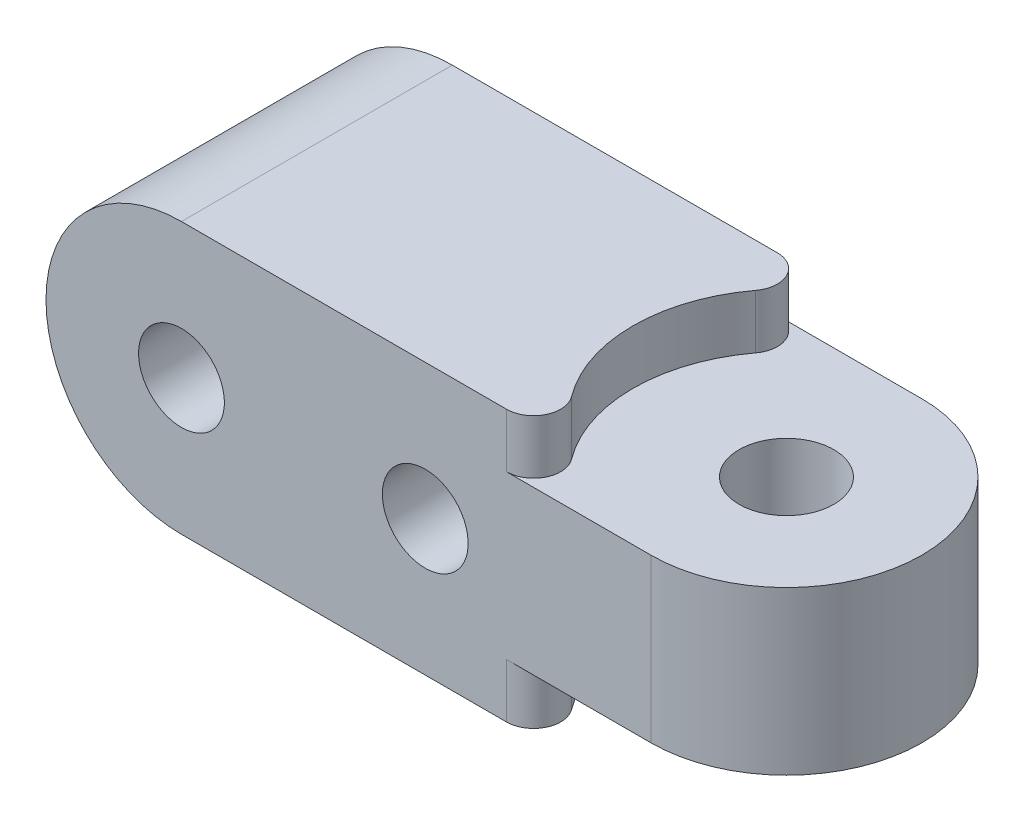
ISO-10303-21;
HEADER;
FILE_DESCRIPTION(('STEP AP214'),'2;1');
FILE_NAME('part.step','',(''),(''),'','','');
FILE_SCHEMA(('AUTOMOTIVE_DESIGN { 1 0 10303 214 1 1 1 1 }'));
ENDSEC;
DATA;
#1=APPLICATION_CONTEXT('core data for automotive mechanical design processes');
#2=APPLICATION_PROTOCOL_DEFINITION('international standard','automotive_design',2000,#1);
#3=PRODUCT_CONTEXT('',#1,'mechanical');
#4=PRODUCT('Part','Part','',(#3));
#5=PRODUCT_RELATED_PRODUCT_CATEGORY('part','',(#4));
#6=PRODUCT_DEFINITION_FORMATION('','',#4);
#7=PRODUCT_DEFINITION_CONTEXT('part definition',#1,'design');
#8=PRODUCT_DEFINITION('design','',#6,#7);
#9=PRODUCT_DEFINITION_SHAPE('','',#8);
#10=(LENGTH_UNIT() NAMED_UNIT(*) SI_UNIT(.MILLI.,.METRE.));
#11=(NAMED_UNIT(*) PLANE_ANGLE_UNIT() SI_UNIT($,.RADIAN.));
#12=(NAMED_UNIT(*) SI_UNIT($,.STERADIAN.) SOLID_ANGLE_UNIT());
#13=UNCERTAINTY_MEASURE_WITH_UNIT(LENGTH_MEASURE(1.E-05),#10,'distance_accuracy_value','');
#14=(GEOMETRIC_REPRESENTATION_CONTEXT(3) GLOBAL_UNCERTAINTY_ASSIGNED_CONTEXT((#13)) GLOBAL_UNIT_ASSIGNED_CONTEXT((#10,
#11,#12)) REPRESENTATION_CONTEXT('',''));
#15=CARTESIAN_POINT('',(0.,0.,0.));
#16=DIRECTION('',(0.,0.,1.));
#17=DIRECTION('',(1.,0.,0.));
#18=AXIS2_PLACEMENT_3D('',#15,#16,#17);
#19=CARTESIAN_POINT('',(0.,1.5,0.));
#20=DIRECTION('',(0.,1.,0.));
#21=DIRECTION('',(0.,0.,1.));
#22=AXIS2_PLACEMENT_3D('',#19,#20,#21);
#23=PLANE('',#22);
#24=DIRECTION('',(1.,0.,0.));
#25=VECTOR('',#24,1.);
#26=CARTESIAN_POINT('',(0.,1.5,-1.5));
#27=LINE('',#26,#25);
#28=CARTESIAN_POINT('',(-1.2,1.5,-1.5));
#29=VERTEX_POINT('',#28);
#30=CARTESIAN_POINT('',(2.4,1.5,-1.5));
#31=VERTEX_POINT('',#30);
#32=EDGE_CURVE('E442',#29,#31,#27,.T.);
#33=ORIENTED_EDGE('',*,*,#32,.F.);
#34=DIRECTION('',(0.,0.,-1.));
#35=VECTOR('',#34,1.);
#36=CARTESIAN_POINT('',(-1.2,1.5,1.5));
#37=LINE('',#36,#35);
#38=CARTESIAN_POINT('',(-1.2,1.5,1.5));
#39=VERTEX_POINT('',#38);
#40=EDGE_CURVE('E452',#39,#29,#37,.T.);
#41=ORIENTED_EDGE('',*,*,#40,.F.);
#42=DIRECTION('',(1.,0.,0.));
#43=VECTOR('',#42,1.);
#44=CARTESIAN_POINT('',(0.,1.5,1.5));
#45=LINE('',#44,#43);
#46=CARTESIAN_POINT('',(2.4,1.5,1.5));
#47=VERTEX_POINT('',#46);
#48=EDGE_CURVE('E219',#39,#47,#45,.T.);
#49=ORIENTED_EDGE('',*,*,#48,.T.);
#50=CARTESIAN_POINT('',(2.4,1.5,1.2));
#51=DIRECTION('',(0.,1.,0.));
#52=DIRECTION('',(0.,0.,1.));
#53=AXIS2_PLACEMENT_3D('',#50,#51,#52);
#54=CIRCLE('',#53,0.300000000000001);
#55=CARTESIAN_POINT('',(2.64,1.5,1.02));
#56=VERTEX_POINT('',#55);
#57=EDGE_CURVE('E129',#56,#47,#54,.F.);
#58=ORIENTED_EDGE('',*,*,#57,.F.);
#59=CARTESIAN_POINT('',(4.,1.5,0.));
#60=DIRECTION('',(0.,1.,0.));
#61=DIRECTION('',(0.,0.,1.));
#62=AXIS2_PLACEMENT_3D('',#59,#60,#61);
#63=CIRCLE('',#62,1.7);
#64=CARTESIAN_POINT('',(2.64,1.5,-1.02));
#65=VERTEX_POINT('',#64);
#66=EDGE_CURVE('E209',#65,#56,#63,.T.);
#67=ORIENTED_EDGE('',*,*,#66,.F.);
#68=CARTESIAN_POINT('',(2.4,1.5,-1.2));
#69=DIRECTION('',(0.,1.,0.));
#70=DIRECTION('',(0.,0.,1.));
#71=AXIS2_PLACEMENT_3D('',#68,#69,#70);
#72=CIRCLE('',#71,0.300000000000001);
#73=EDGE_CURVE('E195',#31,#65,#72,.F.);
#74=ORIENTED_EDGE('',*,*,#73,.F.);
#75=EDGE_LOOP('',(#33,#41,#49,#58,#67,#74));
#76=FACE_BOUND('',#75,.T.);
#77=ADVANCED_FACE('F43',(#76),#23,.T.);
#78=CARTESIAN_POINT('',(0.,-1.5,0.));
#79=DIRECTION('',(0.,1.,0.));
#80=DIRECTION('',(0.,0.,1.));
#81=AXIS2_PLACEMENT_3D('',#78,#79,#80);
#82=PLANE('',#81);
#83=DIRECTION('',(0.,0.,-1.));
#84=VECTOR('',#83,1.);
#85=CARTESIAN_POINT('',(-1.2,-1.5,1.5));
#86=LINE('',#85,#84);
#87=CARTESIAN_POINT('',(-1.2,-1.5,1.5));
#88=VERTEX_POINT('',#87);
#89=CARTESIAN_POINT('',(-1.2,-1.5,-1.5));
#90=VERTEX_POINT('',#89);
#91=EDGE_CURVE('E227',#88,#90,#86,.T.);
#92=ORIENTED_EDGE('',*,*,#91,.T.);
#93=DIRECTION('',(1.,0.,0.));
#94=VECTOR('',#93,1.);
#95=CARTESIAN_POINT('',(0.,-1.5,-1.5));
#96=LINE('',#95,#94);
#97=CARTESIAN_POINT('',(2.4,-1.5,-1.5));
#98=VERTEX_POINT('',#97);
#99=EDGE_CURVE('E197',#90,#98,#96,.T.);
#100=ORIENTED_EDGE('',*,*,#99,.T.);
#101=CARTESIAN_POINT('',(2.4,-1.5,-1.2));
#102=DIRECTION('',(0.,1.,0.));
#103=DIRECTION('',(0.,0.,1.));
#104=AXIS2_PLACEMENT_3D('',#101,#102,#103);
#105=CIRCLE('',#104,0.300000000000001);
#106=CARTESIAN_POINT('',(2.64,-1.5,-1.02));
#107=VERTEX_POINT('',#106);
#108=EDGE_CURVE('E223',#98,#107,#105,.F.);
#109=ORIENTED_EDGE('',*,*,#108,.T.);
#110=CARTESIAN_POINT('',(4.,-1.5,0.));
#111=DIRECTION('',(0.,1.,0.));
#112=DIRECTION('',(0.,0.,1.));
#113=AXIS2_PLACEMENT_3D('',#110,#111,#112);
#114=CIRCLE('',#113,1.7);
#115=CARTESIAN_POINT('',(2.64,-1.5,1.02));
#116=VERTEX_POINT('',#115);
#117=EDGE_CURVE('E193',#107,#116,#114,.T.);
#118=ORIENTED_EDGE('',*,*,#117,.T.);
#119=CARTESIAN_POINT('',(2.4,-1.5,1.2));
#120=DIRECTION('',(0.,1.,0.));
#121=DIRECTION('',(0.,0.,1.));
#122=AXIS2_PLACEMENT_3D('',#119,#120,#121);
#123=CIRCLE('',#122,0.300000000000001);
#124=CARTESIAN_POINT('',(2.4,-1.5,1.5));
#125=VERTEX_POINT('',#124);
#126=EDGE_CURVE('E184',#116,#125,#123,.F.);
#127=ORIENTED_EDGE('',*,*,#126,.T.);
#128=DIRECTION('',(1.,0.,0.));
#129=VECTOR('',#128,1.);
#130=CARTESIAN_POINT('',(0.,-1.5,1.5));
#131=LINE('',#130,#129);
#132=EDGE_CURVE('E177',#88,#125,#131,.T.);
#133=ORIENTED_EDGE('',*,*,#132,.F.);
#134=EDGE_LOOP('',(#92,#100,#109,#118,#127,#133));
#135=FACE_BOUND('',#134,.T.);
#136=ADVANCED_FACE('F189',(#135),#82,.F.);
#137=CARTESIAN_POINT('',(0.,0.9,-1.5));
#138=DIRECTION('',(0.,0.,-1.));
#139=DIRECTION('',(-1.,0.,0.));
#140=AXIS2_PLACEMENT_3D('',#137,#138,#139);
#141=PLANE('',#140);
#142=CARTESIAN_POINT('',(-1.2,0.,-1.5));
#143=DIRECTION('',(0.,0.,1.));
#144=DIRECTION('',(1.,0.,0.));
#145=AXIS2_PLACEMENT_3D('',#142,#143,#144);
#146=CIRCLE('',#145,1.5);
#147=EDGE_CURVE('E58',#29,#90,#146,.T.);
#148=ORIENTED_EDGE('',*,*,#147,.F.);
#149=ORIENTED_EDGE('',*,*,#32,.T.);
#150=DIRECTION('',(0.,-1.,0.));
#151=VECTOR('',#150,1.);
#152=CARTESIAN_POINT('',(2.4,1.5,-1.5));
#153=LINE('',#152,#151);
#154=CARTESIAN_POINT('',(2.4,0.9,-1.5));
#155=VERTEX_POINT('',#154);
#156=EDGE_CURVE('E134',#31,#155,#153,.T.);
#157=ORIENTED_EDGE('',*,*,#156,.T.);
#158=DIRECTION('',(1.,0.,0.));
#159=VECTOR('',#158,1.);
#160=CARTESIAN_POINT('',(0.,0.9,-1.5));
#161=LINE('',#160,#159);
#162=CARTESIAN_POINT('',(4.,0.9,-1.5));
#163=VERTEX_POINT('',#162);
#164=EDGE_CURVE('E95',#155,#163,#161,.T.);
#165=ORIENTED_EDGE('',*,*,#164,.T.);
#166=DIRECTION('',(0.,-1.,0.));
#167=VECTOR('',#166,1.);
#168=CARTESIAN_POINT('',(4.,0.9,-1.5));
#169=LINE('',#168,#167);
#170=CARTESIAN_POINT('',(4.,-0.9,-1.5));
#171=VERTEX_POINT('',#170);
#172=EDGE_CURVE('E51',#163,#171,#169,.T.);
#173=ORIENTED_EDGE('',*,*,#172,.T.);
#174=DIRECTION('',(1.,0.,0.));
#175=VECTOR('',#174,1.);
#176=CARTESIAN_POINT('',(0.,-0.9,-1.5));
#177=LINE('',#176,#175);
#178=CARTESIAN_POINT('',(2.4,-0.9,-1.5));
#179=VERTEX_POINT('',#178);
#180=EDGE_CURVE('E154',#179,#171,#177,.T.);
#181=ORIENTED_EDGE('',*,*,#180,.F.);
#182=EDGE_CURVE('E130',#179,#98,#153,.T.);
#183=ORIENTED_EDGE('',*,*,#182,.T.);
#184=ORIENTED_EDGE('',*,*,#99,.F.);
#185=EDGE_LOOP('',(#148,#149,#157,#165,#173,#181,#183,#184));
#186=FACE_BOUND('',#185,.T.);
#187=CARTESIAN_POINT('',(1.5,0.,-1.5));
#188=DIRECTION('',(0.,0.,-1.));
#189=DIRECTION('',(-1.,0.,0.));
#190=AXIS2_PLACEMENT_3D('',#187,#188,#189);
#191=CIRCLE('',#190,0.474999999999988);
#192=CARTESIAN_POINT('',(1.02500000000001,0.,-1.5));
#193=VERTEX_POINT('',#192);
#194=EDGE_CURVE('E457',#193,#193,#191,.T.);
#195=ORIENTED_EDGE('',*,*,#194,.F.);
#196=EDGE_LOOP('',(#195));
#197=FACE_BOUND('',#196,.T.);
#198=CARTESIAN_POINT('',(-1.2,0.,-1.5));
#199=DIRECTION('',(0.,0.,-1.));
#200=DIRECTION('',(-1.,0.,0.));
#201=AXIS2_PLACEMENT_3D('',#198,#199,#200);
#202=CIRCLE('',#201,0.474999999999988);
#203=CARTESIAN_POINT('',(-1.67499999999999,0.,-1.5));
#204=VERTEX_POINT('',#203);
#205=EDGE_CURVE('E464',#204,#204,#202,.T.);
#206=ORIENTED_EDGE('',*,*,#205,.F.);
#207=EDGE_LOOP('',(#206));
#208=FACE_BOUND('',#207,.T.);
#209=ADVANCED_FACE('F231',(#186,#197,#208),#141,.T.);
#210=CARTESIAN_POINT('',(0.,0.9,1.5));
#211=DIRECTION('',(0.,0.,-1.));
#212=DIRECTION('',(-1.,0.,0.));
#213=AXIS2_PLACEMENT_3D('',#210,#211,#212);
#214=PLANE('',#213);
#215=CARTESIAN_POINT('',(1.5,0.,1.5));
#216=DIRECTION('',(0.,0.,-1.));
#217=DIRECTION('',(-1.,0.,0.));
#218=AXIS2_PLACEMENT_3D('',#215,#216,#217);
#219=CIRCLE('',#218,0.474999999999999);
#220=CARTESIAN_POINT('',(1.025,0.,1.5));
#221=VERTEX_POINT('',#220);
#222=EDGE_CURVE('E461',#221,#221,#219,.T.);
#223=ORIENTED_EDGE('',*,*,#222,.T.);
#224=EDGE_LOOP('',(#223));
#225=FACE_BOUND('',#224,.T.);
#226=CARTESIAN_POINT('',(-1.2,0.,1.5));
#227=DIRECTION('',(0.,0.,-1.));
#228=DIRECTION('',(-1.,0.,0.));
#229=AXIS2_PLACEMENT_3D('',#226,#227,#228);
#230=CIRCLE('',#229,0.474999999999999);
#231=CARTESIAN_POINT('',(-1.675,0.,1.5));
#232=VERTEX_POINT('',#231);
#233=EDGE_CURVE('E224',#232,#232,#230,.T.);
#234=ORIENTED_EDGE('',*,*,#233,.T.);
#235=EDGE_LOOP('',(#234));
#236=FACE_BOUND('',#235,.T.);
#237=ORIENTED_EDGE('',*,*,#48,.F.);
#238=CARTESIAN_POINT('',(-1.2,0.,1.5));
#239=DIRECTION('',(0.,0.,1.));
#240=DIRECTION('',(1.,0.,0.));
#241=AXIS2_PLACEMENT_3D('',#238,#239,#240);
#242=CIRCLE('',#241,1.5);
#243=EDGE_CURVE('E450',#39,#88,#242,.T.);
#244=ORIENTED_EDGE('',*,*,#243,.T.);
#245=ORIENTED_EDGE('',*,*,#132,.T.);
#246=DIRECTION('',(0.,-1.,0.));
#247=VECTOR('',#246,1.);
#248=CARTESIAN_POINT('',(2.4,1.5,1.5));
#249=LINE('',#248,#247);
#250=CARTESIAN_POINT('',(2.4,-0.9,1.5));
#251=VERTEX_POINT('',#250);
#252=EDGE_CURVE('E131',#251,#125,#249,.T.);
#253=ORIENTED_EDGE('',*,*,#252,.F.);
#254=DIRECTION('',(1.,0.,0.));
#255=VECTOR('',#254,1.);
#256=CARTESIAN_POINT('',(0.,-0.9,1.5));
#257=LINE('',#256,#255);
#258=CARTESIAN_POINT('',(4.,-0.9,1.5));
#259=VERTEX_POINT('',#258);
#260=EDGE_CURVE('E165',#251,#259,#257,.T.);
#261=ORIENTED_EDGE('',*,*,#260,.T.);
#262=DIRECTION('',(0.,-1.,0.));
#263=VECTOR('',#262,1.);
#264=CARTESIAN_POINT('',(4.,0.9,1.5));
#265=LINE('',#264,#263);
#266=CARTESIAN_POINT('',(4.,0.9,1.5));
#267=VERTEX_POINT('',#266);
#268=EDGE_CURVE('E11',#267,#259,#265,.T.);
#269=ORIENTED_EDGE('',*,*,#268,.F.);
#270=DIRECTION('',(1.,0.,0.));
#271=VECTOR('',#270,1.);
#272=CARTESIAN_POINT('',(0.,0.9,1.5));
#273=LINE('',#272,#271);
#274=CARTESIAN_POINT('',(2.4,0.9,1.5));
#275=VERTEX_POINT('',#274);
#276=EDGE_CURVE('E107',#275,#267,#273,.T.);
#277=ORIENTED_EDGE('',*,*,#276,.F.);
#278=EDGE_CURVE('E113',#47,#275,#249,.T.);
#279=ORIENTED_EDGE('',*,*,#278,.F.);
#280=EDGE_LOOP('',(#237,#244,#245,#253,#261,#269,#277,#279));
#281=FACE_BOUND('',#280,.T.);
#282=ADVANCED_FACE('F110',(#225,#236,#281),#214,.F.);
#283=CARTESIAN_POINT('',(4.,0.9,0.));
#284=DIRECTION('',(0.,-1.,0.));
#285=DIRECTION('',(0.,0.,-1.));
#286=AXIS2_PLACEMENT_3D('',#283,#284,#285);
#287=CYLINDRICAL_SURFACE('',#286,0.524999999999999);
#288=CARTESIAN_POINT('',(4.,0.9,0.));
#289=DIRECTION('',(0.,1.,0.));
#290=DIRECTION('',(0.,0.,1.));
#291=AXIS2_PLACEMENT_3D('',#288,#289,#290);
#292=CIRCLE('',#291,0.524999999999999);
#293=CARTESIAN_POINT('',(4.,0.9,0.524999999999998));
#294=VERTEX_POINT('',#293);
#295=EDGE_CURVE('E143',#294,#294,#292,.T.);
#296=ORIENTED_EDGE('',*,*,#295,.T.);
#297=EDGE_LOOP('',(#296));
#298=FACE_BOUND('',#297,.T.);
#299=CARTESIAN_POINT('',(4.,-0.9,0.));
#300=DIRECTION('',(0.,1.,0.));
#301=DIRECTION('',(0.,0.,1.));
#302=AXIS2_PLACEMENT_3D('',#299,#300,#301);
#303=CIRCLE('',#302,0.524999999999999);
#304=CARTESIAN_POINT('',(4.,-0.9,0.524999999999998));
#305=VERTEX_POINT('',#304);
#306=EDGE_CURVE('E142',#305,#305,#303,.T.);
#307=ORIENTED_EDGE('',*,*,#306,.F.);
#308=EDGE_LOOP('',(#307));
#309=FACE_BOUND('',#308,.T.);
#310=ADVANCED_FACE('F45',(#298,#309),#287,.F.);
#311=CARTESIAN_POINT('',(4.,0.9,0.));
#312=DIRECTION('',(0.,-1.,0.));
#313=DIRECTION('',(0.,0.,-1.));
#314=AXIS2_PLACEMENT_3D('',#311,#312,#313);
#315=CYLINDRICAL_SURFACE('',#314,1.5);
#316=CARTESIAN_POINT('',(4.,-0.9,0.));
#317=DIRECTION('',(0.,1.,0.));
#318=DIRECTION('',(0.,0.,1.));
#319=AXIS2_PLACEMENT_3D('',#316,#317,#318);
#320=CIRCLE('',#319,1.5);
#321=EDGE_CURVE('E146',#171,#259,#320,.F.);
#322=ORIENTED_EDGE('',*,*,#321,.F.);
#323=ORIENTED_EDGE('',*,*,#172,.F.);
#324=CARTESIAN_POINT('',(4.,0.9,0.));
#325=DIRECTION('',(0.,1.,0.));
#326=DIRECTION('',(0.,0.,1.));
#327=AXIS2_PLACEMENT_3D('',#324,#325,#326);
#328=CIRCLE('',#327,1.5);
#329=EDGE_CURVE('E116',#163,#267,#328,.F.);
#330=ORIENTED_EDGE('',*,*,#329,.T.);
#331=ORIENTED_EDGE('',*,*,#268,.T.);
#332=EDGE_LOOP('',(#322,#323,#330,#331));
#333=FACE_BOUND('',#332,.T.);
#334=ADVANCED_FACE('F171',(#333),#315,.T.);
#335=CARTESIAN_POINT('',(0.,0.9,0.));
#336=DIRECTION('',(0.,1.,0.));
#337=DIRECTION('',(0.,0.,1.));
#338=AXIS2_PLACEMENT_3D('',#335,#336,#337);
#339=PLANE('',#338);
#340=ORIENTED_EDGE('',*,*,#295,.F.);
#341=EDGE_LOOP('',(#340));
#342=FACE_BOUND('',#341,.T.);
#343=ORIENTED_EDGE('',*,*,#164,.F.);
#344=CARTESIAN_POINT('',(2.4,0.9,-1.2));
#345=DIRECTION('',(0.,1.,0.));
#346=DIRECTION('',(0.,0.,1.));
#347=AXIS2_PLACEMENT_3D('',#344,#345,#346);
#348=CIRCLE('',#347,0.300000000000001);
#349=CARTESIAN_POINT('',(2.64,0.9,-1.02));
#350=VERTEX_POINT('',#349);
#351=EDGE_CURVE('E148',#155,#350,#348,.F.);
#352=ORIENTED_EDGE('',*,*,#351,.T.);
#353=CARTESIAN_POINT('',(4.,0.9,0.));
#354=DIRECTION('',(0.,1.,0.));
#355=DIRECTION('',(0.,0.,1.));
#356=AXIS2_PLACEMENT_3D('',#353,#354,#355);
#357=CIRCLE('',#356,1.7);
#358=CARTESIAN_POINT('',(2.64,0.9,1.02));
#359=VERTEX_POINT('',#358);
#360=EDGE_CURVE('E122',#350,#359,#357,.T.);
#361=ORIENTED_EDGE('',*,*,#360,.T.);
#362=CARTESIAN_POINT('',(2.4,0.9,1.2));
#363=DIRECTION('',(0.,1.,0.));
#364=DIRECTION('',(0.,0.,1.));
#365=AXIS2_PLACEMENT_3D('',#362,#363,#364);
#366=CIRCLE('',#365,0.300000000000001);
#367=EDGE_CURVE('E117',#359,#275,#366,.F.);
#368=ORIENTED_EDGE('',*,*,#367,.T.);
#369=ORIENTED_EDGE('',*,*,#276,.T.);
#370=ORIENTED_EDGE('',*,*,#329,.F.);
#371=EDGE_LOOP('',(#343,#352,#361,#368,#369,#370));
#372=FACE_BOUND('',#371,.T.);
#373=ADVANCED_FACE('F120',(#342,#372),#339,.T.);
#374=CARTESIAN_POINT('',(0.,-0.9,0.));
#375=DIRECTION('',(0.,1.,0.));
#376=DIRECTION('',(0.,0.,1.));
#377=AXIS2_PLACEMENT_3D('',#374,#375,#376);
#378=PLANE('',#377);
#379=ORIENTED_EDGE('',*,*,#306,.T.);
#380=EDGE_LOOP('',(#379));
#381=FACE_BOUND('',#380,.T.);
#382=ORIENTED_EDGE('',*,*,#180,.T.);
#383=ORIENTED_EDGE('',*,*,#321,.T.);
#384=ORIENTED_EDGE('',*,*,#260,.F.);
#385=CARTESIAN_POINT('',(2.4,-0.9,1.2));
#386=DIRECTION('',(0.,1.,0.));
#387=DIRECTION('',(0.,0.,1.));
#388=AXIS2_PLACEMENT_3D('',#385,#386,#387);
#389=CIRCLE('',#388,0.300000000000001);
#390=CARTESIAN_POINT('',(2.64,-0.9,1.02));
#391=VERTEX_POINT('',#390);
#392=EDGE_CURVE('E162',#391,#251,#389,.F.);
#393=ORIENTED_EDGE('',*,*,#392,.F.);
#394=CARTESIAN_POINT('',(4.,-0.9,0.));
#395=DIRECTION('',(0.,1.,0.));
#396=DIRECTION('',(0.,0.,1.));
#397=AXIS2_PLACEMENT_3D('',#394,#395,#396);
#398=CIRCLE('',#397,1.7);
#399=CARTESIAN_POINT('',(2.64,-0.9,-1.02));
#400=VERTEX_POINT('',#399);
#401=EDGE_CURVE('E159',#400,#391,#398,.T.);
#402=ORIENTED_EDGE('',*,*,#401,.F.);
#403=CARTESIAN_POINT('',(2.4,-0.9,-1.2));
#404=DIRECTION('',(0.,1.,0.));
#405=DIRECTION('',(0.,0.,1.));
#406=AXIS2_PLACEMENT_3D('',#403,#404,#405);
#407=CIRCLE('',#406,0.300000000000001);
#408=EDGE_CURVE('E156',#179,#400,#407,.F.);
#409=ORIENTED_EDGE('',*,*,#408,.F.);
#410=EDGE_LOOP('',(#382,#383,#384,#393,#402,#409));
#411=FACE_BOUND('',#410,.T.);
#412=ADVANCED_FACE('F169',(#381,#411),#378,.F.);
#413=CARTESIAN_POINT('',(2.4,1.5,-1.2));
#414=DIRECTION('',(0.,-1.,0.));
#415=DIRECTION('',(0.,0.,-1.));
#416=AXIS2_PLACEMENT_3D('',#413,#414,#415);
#417=CYLINDRICAL_SURFACE('',#416,0.300000000000001);
#418=ORIENTED_EDGE('',*,*,#408,.T.);
#419=DIRECTION('',(0.,-1.,0.));
#420=VECTOR('',#419,1.);
#421=CARTESIAN_POINT('',(2.64,1.5,-1.02));
#422=LINE('',#421,#420);
#423=EDGE_CURVE('E203',#400,#107,#422,.T.);
#424=ORIENTED_EDGE('',*,*,#423,.T.);
#425=ORIENTED_EDGE('',*,*,#108,.F.);
#426=ORIENTED_EDGE('',*,*,#182,.F.);
#427=EDGE_LOOP('',(#418,#424,#425,#426));
#428=FACE_BOUND('',#427,.T.);
#429=ADVANCED_FACE('F233',(#428),#417,.T.);
#430=CARTESIAN_POINT('',(2.4,1.5,1.2));
#431=DIRECTION('',(0.,-1.,0.));
#432=DIRECTION('',(0.,0.,-1.));
#433=AXIS2_PLACEMENT_3D('',#430,#431,#432);
#434=CYLINDRICAL_SURFACE('',#433,0.300000000000001);
#435=ORIENTED_EDGE('',*,*,#392,.T.);
#436=ORIENTED_EDGE('',*,*,#252,.T.);
#437=ORIENTED_EDGE('',*,*,#126,.F.);
#438=DIRECTION('',(0.,-1.,0.));
#439=VECTOR('',#438,1.);
#440=CARTESIAN_POINT('',(2.64,1.5,1.02));
#441=LINE('',#440,#439);
#442=EDGE_CURVE('E202',#391,#116,#441,.T.);
#443=ORIENTED_EDGE('',*,*,#442,.F.);
#444=EDGE_LOOP('',(#435,#436,#437,#443));
#445=FACE_BOUND('',#444,.T.);
#446=ADVANCED_FACE('F181',(#445),#434,.T.);
#447=CARTESIAN_POINT('',(4.,1.5,0.));
#448=DIRECTION('',(0.,-1.,0.));
#449=DIRECTION('',(0.,0.,-1.));
#450=AXIS2_PLACEMENT_3D('',#447,#448,#449);
#451=CYLINDRICAL_SURFACE('',#450,1.7);
#452=ORIENTED_EDGE('',*,*,#401,.T.);
#453=ORIENTED_EDGE('',*,*,#442,.T.);
#454=ORIENTED_EDGE('',*,*,#117,.F.);
#455=ORIENTED_EDGE('',*,*,#423,.F.);
#456=EDGE_LOOP('',(#452,#453,#454,#455));
#457=FACE_BOUND('',#456,.T.);
#458=ADVANCED_FACE('F241',(#457),#451,.F.);
#459=EDGE_CURVE('E200',#65,#350,#422,.T.);
#460=ORIENTED_EDGE('',*,*,#459,.T.);
#461=ORIENTED_EDGE('',*,*,#351,.F.);
#462=ORIENTED_EDGE('',*,*,#156,.F.);
#463=ORIENTED_EDGE('',*,*,#73,.T.);
#464=EDGE_LOOP('',(#460,#461,#462,#463));
#465=FACE_BOUND('',#464,.T.);
#466=ADVANCED_FACE('F236',(#465),#417,.T.);
#467=ORIENTED_EDGE('',*,*,#278,.T.);
#468=ORIENTED_EDGE('',*,*,#367,.F.);
#469=EDGE_CURVE('E137',#56,#359,#441,.T.);
#470=ORIENTED_EDGE('',*,*,#469,.F.);
#471=ORIENTED_EDGE('',*,*,#57,.T.);
#472=EDGE_LOOP('',(#467,#468,#470,#471));
#473=FACE_BOUND('',#472,.T.);
#474=ADVANCED_FACE('F127',(#473),#434,.T.);
#475=ORIENTED_EDGE('',*,*,#469,.T.);
#476=ORIENTED_EDGE('',*,*,#360,.F.);
#477=ORIENTED_EDGE('',*,*,#459,.F.);
#478=ORIENTED_EDGE('',*,*,#66,.T.);
#479=EDGE_LOOP('',(#475,#476,#477,#478));
#480=FACE_BOUND('',#479,.T.);
#481=ADVANCED_FACE('F259',(#480),#451,.F.);
#482=CARTESIAN_POINT('',(-1.2,0.,-1.5));
#483=DIRECTION('',(0.,0.,-1.));
#484=DIRECTION('',(-1.,0.,0.));
#485=AXIS2_PLACEMENT_3D('',#482,#483,#484);
#486=CYLINDRICAL_SURFACE('',#485,0.474999999999993);
#487=ORIENTED_EDGE('',*,*,#233,.F.);
#488=EDGE_LOOP('',(#487));
#489=FACE_BOUND('',#488,.T.);
#490=ORIENTED_EDGE('',*,*,#205,.T.);
#491=EDGE_LOOP('',(#490));
#492=FACE_BOUND('',#491,.T.);
#493=ADVANCED_FACE('F256',(#489,#492),#486,.F.);
#494=CARTESIAN_POINT('',(1.5,0.,-1.5));
#495=DIRECTION('',(0.,0.,-1.));
#496=DIRECTION('',(-1.,0.,0.));
#497=AXIS2_PLACEMENT_3D('',#494,#495,#496);
#498=CYLINDRICAL_SURFACE('',#497,0.474999999999993);
#499=ORIENTED_EDGE('',*,*,#222,.F.);
#500=EDGE_LOOP('',(#499));
#501=FACE_BOUND('',#500,.T.);
#502=ORIENTED_EDGE('',*,*,#194,.T.);
#503=EDGE_LOOP('',(#502));
#504=FACE_BOUND('',#503,.T.);
#505=ADVANCED_FACE('F278',(#501,#504),#498,.F.);
#506=CARTESIAN_POINT('',(-1.2,0.,1.5));
#507=DIRECTION('',(0.,0.,-1.));
#508=DIRECTION('',(-1.,0.,0.));
#509=AXIS2_PLACEMENT_3D('',#506,#507,#508);
#510=CYLINDRICAL_SURFACE('',#509,1.5);
#511=ORIENTED_EDGE('',*,*,#147,.T.);
#512=ORIENTED_EDGE('',*,*,#91,.F.);
#513=ORIENTED_EDGE('',*,*,#243,.F.);
#514=ORIENTED_EDGE('',*,*,#40,.T.);
#515=EDGE_LOOP('',(#511,#512,#513,#514));
#516=FACE_BOUND('',#515,.T.);
#517=ADVANCED_FACE('F286',(#516),#510,.T.);
#518=CLOSED_SHELL('',(#77,#136,#209,#282,#310,#334,#373,#412,#429,#446,#458,#466,#474,#481,#493,
#505,#517));
#519=MANIFOLD_SOLID_BREP('B2',#518);
#520=ADVANCED_BREP_SHAPE_REPRESENTATION('',(#18,#519),#14);
#521=SHAPE_DEFINITION_REPRESENTATION(#9,#520);
ENDSEC;
END-ISO-10303-21;
